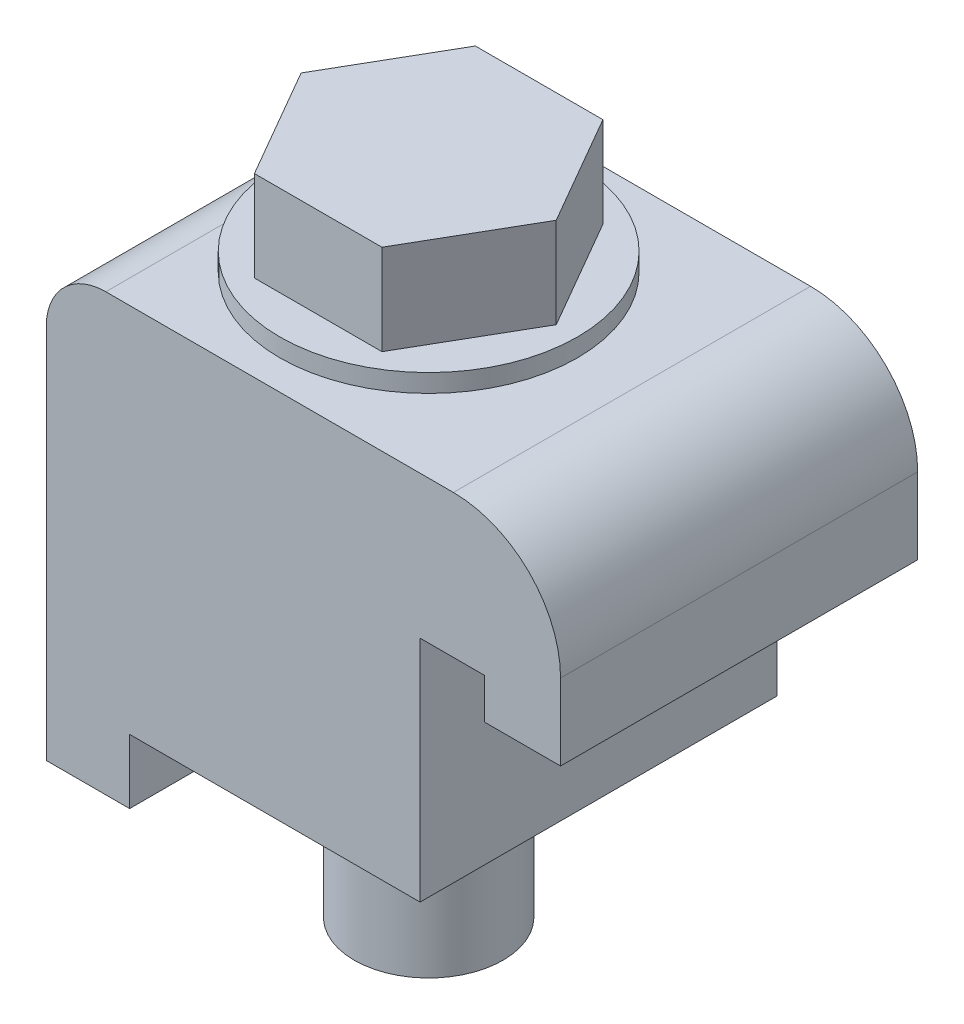
ISO-10303-21;
HEADER;
FILE_DESCRIPTION(('STEP AP214'),'2;1');
FILE_NAME('part.step','',(''),(''),'','','');
FILE_SCHEMA(('AUTOMOTIVE_DESIGN { 1 0 10303 214 1 1 1 1 }'));
ENDSEC;
DATA;
#1=APPLICATION_CONTEXT('core data for automotive mechanical design processes');
#2=APPLICATION_PROTOCOL_DEFINITION('international standard','automotive_design',2000,#1);
#3=PRODUCT_CONTEXT('',#1,'mechanical');
#4=PRODUCT('Part','Part','',(#3));
#5=PRODUCT_RELATED_PRODUCT_CATEGORY('part','',(#4));
#6=PRODUCT_DEFINITION_FORMATION('','',#4);
#7=PRODUCT_DEFINITION_CONTEXT('part definition',#1,'design');
#8=PRODUCT_DEFINITION('design','',#6,#7);
#9=PRODUCT_DEFINITION_SHAPE('','',#8);
#10=(LENGTH_UNIT() NAMED_UNIT(*) SI_UNIT(.MILLI.,.METRE.));
#11=(NAMED_UNIT(*) PLANE_ANGLE_UNIT() SI_UNIT($,.RADIAN.));
#12=(NAMED_UNIT(*) SI_UNIT($,.STERADIAN.) SOLID_ANGLE_UNIT());
#13=UNCERTAINTY_MEASURE_WITH_UNIT(LENGTH_MEASURE(1.E-05),#10,'distance_accuracy_value','');
#14=(GEOMETRIC_REPRESENTATION_CONTEXT(3) GLOBAL_UNCERTAINTY_ASSIGNED_CONTEXT((#13)) GLOBAL_UNIT_ASSIGNED_CONTEXT((#10,
#11,#12)) REPRESENTATION_CONTEXT('',''));
#15=CARTESIAN_POINT('',(0.,0.,0.));
#16=DIRECTION('',(0.,0.,1.));
#17=DIRECTION('',(1.,0.,0.));
#18=AXIS2_PLACEMENT_3D('',#15,#16,#17);
#19=CARTESIAN_POINT('',(-147.263380667439,27.57019994,0.));
#20=DIRECTION('',(-0.866025403784438,0.,0.500000000000001));
#21=DIRECTION('',(0.500000000000001,0.,0.866025403784438));
#22=AXIS2_PLACEMENT_3D('',#19,#20,#21);
#23=PLANE('',#22);
#24=DIRECTION('',(-0.500000000000001,0.,-0.866025403784438));
#25=VECTOR('',#24,1.);
#26=CARTESIAN_POINT('',(-147.263380667439,22.74419994,0.));
#27=LINE('',#26,#25);
#28=CARTESIAN_POINT('',(-147.263380667439,22.74419994,0.));
#29=VERTEX_POINT('',#28);
#30=CARTESIAN_POINT('',(-150.665590333719,22.74419994,-5.8928));
#31=VERTEX_POINT('',#30);
#32=EDGE_CURVE('E169',#29,#31,#27,.T.);
#33=ORIENTED_EDGE('',*,*,#32,.T.);
#34=DIRECTION('',(0.,-1.,0.));
#35=VECTOR('',#34,1.);
#36=CARTESIAN_POINT('',(-150.665590333719,27.57019994,-5.8928));
#37=LINE('',#36,#35);
#38=CARTESIAN_POINT('',(-150.665590333719,27.57019994,-5.8928));
#39=VERTEX_POINT('',#38);
#40=EDGE_CURVE('E51',#39,#31,#37,.T.);
#41=ORIENTED_EDGE('',*,*,#40,.F.);
#42=DIRECTION('',(-0.500000000000001,0.,-0.866025403784438));
#43=VECTOR('',#42,1.);
#44=CARTESIAN_POINT('',(-147.263380667439,27.57019994,0.));
#45=LINE('',#44,#43);
#46=CARTESIAN_POINT('',(-147.263380667439,27.57019994,0.));
#47=VERTEX_POINT('',#46);
#48=EDGE_CURVE('E180',#47,#39,#45,.T.);
#49=ORIENTED_EDGE('',*,*,#48,.F.);
#50=DIRECTION('',(0.,-1.,0.));
#51=VECTOR('',#50,1.);
#52=CARTESIAN_POINT('',(-147.263380667439,27.57019994,0.));
#53=LINE('',#52,#51);
#54=EDGE_CURVE('E165',#47,#29,#53,.T.);
#55=ORIENTED_EDGE('',*,*,#54,.T.);
#56=EDGE_LOOP('',(#33,#41,#49,#55));
#57=FACE_BOUND('',#56,.T.);
#58=ADVANCED_FACE('F85',(#57),#23,.F.);
#59=CARTESIAN_POINT('',(-150.665590333719,27.57019994,-5.8928));
#60=DIRECTION('',(0.,0.,1.));
#61=DIRECTION('',(1.,0.,0.));
#62=AXIS2_PLACEMENT_3D('',#59,#60,#61);
#63=PLANE('',#62);
#64=DIRECTION('',(-1.,0.,0.));
#65=VECTOR('',#64,1.);
#66=CARTESIAN_POINT('',(-150.665590333719,22.74419994,-5.8928));
#67=LINE('',#66,#65);
#68=CARTESIAN_POINT('',(-157.470009666281,22.74419994,-5.8928));
#69=VERTEX_POINT('',#68);
#70=EDGE_CURVE('E172',#31,#69,#67,.T.);
#71=ORIENTED_EDGE('',*,*,#70,.T.);
#72=DIRECTION('',(0.,-1.,0.));
#73=VECTOR('',#72,1.);
#74=CARTESIAN_POINT('',(-157.470009666281,27.57019994,-5.8928));
#75=LINE('',#74,#73);
#76=CARTESIAN_POINT('',(-157.470009666281,27.57019994,-5.8928));
#77=VERTEX_POINT('',#76);
#78=EDGE_CURVE('E93',#77,#69,#75,.T.);
#79=ORIENTED_EDGE('',*,*,#78,.F.);
#80=DIRECTION('',(-1.,0.,0.));
#81=VECTOR('',#80,1.);
#82=CARTESIAN_POINT('',(-150.665590333719,27.57019994,-5.8928));
#83=LINE('',#82,#81);
#84=EDGE_CURVE('E138',#39,#77,#83,.T.);
#85=ORIENTED_EDGE('',*,*,#84,.F.);
#86=ORIENTED_EDGE('',*,*,#40,.T.);
#87=EDGE_LOOP('',(#71,#79,#85,#86));
#88=FACE_BOUND('',#87,.T.);
#89=ADVANCED_FACE('F204',(#88),#63,.F.);
#90=CARTESIAN_POINT('',(-157.470009666281,27.57019994,-5.8928));
#91=DIRECTION('',(0.866025403784439,0.,0.5));
#92=DIRECTION('',(0.5,0.,-0.866025403784439));
#93=AXIS2_PLACEMENT_3D('',#90,#91,#92);
#94=PLANE('',#93);
#95=DIRECTION('',(-0.5,0.,0.866025403784439));
#96=VECTOR('',#95,1.);
#97=CARTESIAN_POINT('',(-157.470009666281,22.74419994,-5.8928));
#98=LINE('',#97,#96);
#99=CARTESIAN_POINT('',(-160.872219332561,22.74419994,0.));
#100=VERTEX_POINT('',#99);
#101=EDGE_CURVE('E175',#69,#100,#98,.T.);
#102=ORIENTED_EDGE('',*,*,#101,.T.);
#103=DIRECTION('',(0.,-1.,0.));
#104=VECTOR('',#103,1.);
#105=CARTESIAN_POINT('',(-160.872219332561,27.57019994,0.));
#106=LINE('',#105,#104);
#107=CARTESIAN_POINT('',(-160.872219332561,27.57019994,0.));
#108=VERTEX_POINT('',#107);
#109=EDGE_CURVE('E160',#108,#100,#106,.T.);
#110=ORIENTED_EDGE('',*,*,#109,.F.);
#111=DIRECTION('',(-0.5,0.,0.866025403784439));
#112=VECTOR('',#111,1.);
#113=CARTESIAN_POINT('',(-157.470009666281,27.57019994,-5.8928));
#114=LINE('',#113,#112);
#115=EDGE_CURVE('E151',#77,#108,#114,.T.);
#116=ORIENTED_EDGE('',*,*,#115,.F.);
#117=ORIENTED_EDGE('',*,*,#78,.T.);
#118=EDGE_LOOP('',(#102,#110,#116,#117));
#119=FACE_BOUND('',#118,.T.);
#120=ADVANCED_FACE('F186',(#119),#94,.F.);
#121=CARTESIAN_POINT('',(-160.872219332561,27.57019994,0.));
#122=DIRECTION('',(0.866025403784438,0.,-0.500000000000001));
#123=DIRECTION('',(-0.500000000000001,0.,-0.866025403784438));
#124=AXIS2_PLACEMENT_3D('',#121,#122,#123);
#125=PLANE('',#124);
#126=DIRECTION('',(0.500000000000001,0.,0.866025403784438));
#127=VECTOR('',#126,1.);
#128=CARTESIAN_POINT('',(-160.872219332561,22.74419994,0.));
#129=LINE('',#128,#127);
#130=CARTESIAN_POINT('',(-157.470009666281,22.74419994,5.8928));
#131=VERTEX_POINT('',#130);
#132=EDGE_CURVE('E159',#100,#131,#129,.T.);
#133=ORIENTED_EDGE('',*,*,#132,.T.);
#134=DIRECTION('',(0.,-1.,0.));
#135=VECTOR('',#134,1.);
#136=CARTESIAN_POINT('',(-157.470009666281,27.57019994,5.8928));
#137=LINE('',#136,#135);
#138=CARTESIAN_POINT('',(-157.470009666281,27.57019994,5.8928));
#139=VERTEX_POINT('',#138);
#140=EDGE_CURVE('E156',#139,#131,#137,.T.);
#141=ORIENTED_EDGE('',*,*,#140,.F.);
#142=DIRECTION('',(0.500000000000001,0.,0.866025403784438));
#143=VECTOR('',#142,1.);
#144=CARTESIAN_POINT('',(-160.872219332561,27.57019994,0.));
#145=LINE('',#144,#143);
#146=EDGE_CURVE('E145',#108,#139,#145,.T.);
#147=ORIENTED_EDGE('',*,*,#146,.F.);
#148=ORIENTED_EDGE('',*,*,#109,.T.);
#149=EDGE_LOOP('',(#133,#141,#147,#148));
#150=FACE_BOUND('',#149,.T.);
#151=ADVANCED_FACE('F157',(#150),#125,.F.);
#152=CARTESIAN_POINT('',(-157.470009666281,27.57019994,5.8928));
#153=DIRECTION('',(0.,0.,-1.));
#154=DIRECTION('',(-1.,0.,0.));
#155=AXIS2_PLACEMENT_3D('',#152,#153,#154);
#156=PLANE('',#155);
#157=DIRECTION('',(1.,0.,0.));
#158=VECTOR('',#157,1.);
#159=CARTESIAN_POINT('',(-157.470009666281,22.74419994,5.8928));
#160=LINE('',#159,#158);
#161=CARTESIAN_POINT('',(-150.665590333719,22.74419994,5.8928));
#162=VERTEX_POINT('',#161);
#163=EDGE_CURVE('E124',#131,#162,#160,.T.);
#164=ORIENTED_EDGE('',*,*,#163,.T.);
#165=DIRECTION('',(0.,-1.,0.));
#166=VECTOR('',#165,1.);
#167=CARTESIAN_POINT('',(-150.665590333719,27.57019994,5.8928));
#168=LINE('',#167,#166);
#169=CARTESIAN_POINT('',(-150.665590333719,27.57019994,5.8928));
#170=VERTEX_POINT('',#169);
#171=EDGE_CURVE('E161',#170,#162,#168,.T.);
#172=ORIENTED_EDGE('',*,*,#171,.F.);
#173=DIRECTION('',(1.,0.,0.));
#174=VECTOR('',#173,1.);
#175=CARTESIAN_POINT('',(-157.470009666281,27.57019994,5.8928));
#176=LINE('',#175,#174);
#177=EDGE_CURVE('E149',#139,#170,#176,.T.);
#178=ORIENTED_EDGE('',*,*,#177,.F.);
#179=ORIENTED_EDGE('',*,*,#140,.T.);
#180=EDGE_LOOP('',(#164,#172,#178,#179));
#181=FACE_BOUND('',#180,.T.);
#182=ADVANCED_FACE('F163',(#181),#156,.F.);
#183=CARTESIAN_POINT('',(-150.665590333719,27.57019994,5.8928));
#184=DIRECTION('',(-0.866025403784439,0.,-0.5));
#185=DIRECTION('',(-0.5,0.,0.866025403784439));
#186=AXIS2_PLACEMENT_3D('',#183,#184,#185);
#187=PLANE('',#186);
#188=DIRECTION('',(0.5,0.,-0.866025403784438));
#189=VECTOR('',#188,1.);
#190=CARTESIAN_POINT('',(-150.665590333719,22.74419994,5.8928));
#191=LINE('',#190,#189);
#192=EDGE_CURVE('E130',#162,#29,#191,.T.);
#193=ORIENTED_EDGE('',*,*,#192,.T.);
#194=ORIENTED_EDGE('',*,*,#54,.F.);
#195=DIRECTION('',(0.5,0.,-0.866025403784438));
#196=VECTOR('',#195,1.);
#197=CARTESIAN_POINT('',(-150.665590333719,27.57019994,5.8928));
#198=LINE('',#197,#196);
#199=EDGE_CURVE('E101',#170,#47,#198,.T.);
#200=ORIENTED_EDGE('',*,*,#199,.F.);
#201=ORIENTED_EDGE('',*,*,#171,.T.);
#202=EDGE_LOOP('',(#193,#194,#200,#201));
#203=FACE_BOUND('',#202,.T.);
#204=ADVANCED_FACE('F193',(#203),#187,.F.);
#205=CARTESIAN_POINT('',(0.,27.57019994,0.));
#206=DIRECTION('',(0.,1.,0.));
#207=DIRECTION('',(0.,0.,1.));
#208=AXIS2_PLACEMENT_3D('',#205,#206,#207);
#209=PLANE('',#208);
#210=ORIENTED_EDGE('',*,*,#48,.T.);
#211=ORIENTED_EDGE('',*,*,#84,.T.);
#212=ORIENTED_EDGE('',*,*,#115,.T.);
#213=ORIENTED_EDGE('',*,*,#146,.T.);
#214=ORIENTED_EDGE('',*,*,#177,.T.);
#215=ORIENTED_EDGE('',*,*,#199,.T.);
#216=EDGE_LOOP('',(#210,#211,#212,#213,#214,#215));
#217=FACE_BOUND('',#216,.T.);
#218=ADVANCED_FACE('F147',(#217),#209,.T.);
#219=CARTESIAN_POINT('',(0.,22.74419994,0.));
#220=DIRECTION('',(0.,1.,0.));
#221=DIRECTION('',(0.,0.,1.));
#222=AXIS2_PLACEMENT_3D('',#219,#220,#221);
#223=PLANE('',#222);
#224=CARTESIAN_POINT('',(-154.0678,22.74419994,0.));
#225=DIRECTION('',(0.,1.,0.));
#226=DIRECTION('',(0.,0.,1.));
#227=AXIS2_PLACEMENT_3D('',#224,#225,#226);
#228=CIRCLE('',#227,3.96874999999999);
#229=CARTESIAN_POINT('',(-154.0678,22.74419994,3.96874999999999));
#230=VERTEX_POINT('',#229);
#231=EDGE_CURVE('E280',#230,#230,#228,.T.);
#232=ORIENTED_EDGE('',*,*,#231,.T.);
#233=EDGE_LOOP('',(#232));
#234=FACE_BOUND('',#233,.T.);
#235=ORIENTED_EDGE('',*,*,#32,.F.);
#236=ORIENTED_EDGE('',*,*,#192,.F.);
#237=ORIENTED_EDGE('',*,*,#163,.F.);
#238=ORIENTED_EDGE('',*,*,#132,.F.);
#239=ORIENTED_EDGE('',*,*,#101,.F.);
#240=ORIENTED_EDGE('',*,*,#70,.F.);
#241=EDGE_LOOP('',(#235,#236,#237,#238,#239,#240));
#242=FACE_BOUND('',#241,.T.);
#243=ADVANCED_FACE('F189',(#234,#242),#223,.F.);
#244=CARTESIAN_POINT('',(-154.0678,-8.03280005999999,0.));
#245=DIRECTION('',(0.,1.,0.));
#246=DIRECTION('',(0.,0.,1.));
#247=AXIS2_PLACEMENT_3D('',#244,#245,#246);
#248=CYLINDRICAL_SURFACE('',#247,3.96874999999999);
#249=CARTESIAN_POINT('',(-154.0678,-8.03280005999999,0.));
#250=DIRECTION('',(0.,1.,0.));
#251=DIRECTION('',(0.,0.,1.));
#252=AXIS2_PLACEMENT_3D('',#249,#250,#251);
#253=CIRCLE('',#252,3.96874999999999);
#254=CARTESIAN_POINT('',(-154.0678,-8.03280005999999,3.96874999999999));
#255=VERTEX_POINT('',#254);
#256=EDGE_CURVE('E173',#255,#255,#253,.T.);
#257=ORIENTED_EDGE('',*,*,#256,.T.);
#258=EDGE_LOOP('',(#257));
#259=FACE_BOUND('',#258,.T.);
#260=ORIENTED_EDGE('',*,*,#231,.F.);
#261=EDGE_LOOP('',(#260));
#262=FACE_BOUND('',#261,.T.);
#263=ADVANCED_FACE('F250',(#259,#262),#248,.T.);
#264=CARTESIAN_POINT('',(-154.0678,-8.03280005999999,0.));
#265=DIRECTION('',(0.,1.,0.));
#266=DIRECTION('',(0.,0.,1.));
#267=AXIS2_PLACEMENT_3D('',#264,#265,#266);
#268=PLANE('',#267);
#269=ORIENTED_EDGE('',*,*,#256,.F.);
#270=EDGE_LOOP('',(#269));
#271=FACE_BOUND('',#270,.T.);
#272=ADVANCED_FACE('F259',(#271),#268,.F.);
#273=CLOSED_SHELL('',(#58,#89,#120,#151,#182,#204,#218,#243,#263,#272));
#274=MANIFOLD_SOLID_BREP('B6',#273);
#275=CARTESIAN_POINT('',(-154.0678,22.74419994,0.));
#276=DIRECTION('',(0.,1.,0.));
#277=DIRECTION('',(0.,0.,1.));
#278=AXIS2_PLACEMENT_3D('',#275,#276,#277);
#279=PLANE('',#278);
#280=CARTESIAN_POINT('',(-154.0678,22.74419994,0.));
#281=DIRECTION('',(0.,1.,0.));
#282=DIRECTION('',(0.,0.,1.));
#283=AXIS2_PLACEMENT_3D('',#280,#281,#282);
#284=CIRCLE('',#283,7.93749999999998);
#285=CARTESIAN_POINT('',(-154.0678,22.74419994,-7.93749999999998));
#286=VERTEX_POINT('',#285);
#287=EDGE_CURVE('E84',#286,#286,#284,.T.);
#288=ORIENTED_EDGE('',*,*,#287,.T.);
#289=EDGE_LOOP('',(#288));
#290=FACE_BOUND('',#289,.T.);
#291=CARTESIAN_POINT('',(-154.0678,22.74419994,0.));
#292=DIRECTION('',(0.,1.,0.));
#293=DIRECTION('',(0.,0.,1.));
#294=AXIS2_PLACEMENT_3D('',#291,#292,#293);
#295=CIRCLE('',#294,4.22910000000001);
#296=CARTESIAN_POINT('',(-154.0678,22.74419994,-4.22910000000001));
#297=VERTEX_POINT('',#296);
#298=EDGE_CURVE('E315',#297,#297,#295,.T.);
#299=ORIENTED_EDGE('',*,*,#298,.F.);
#300=EDGE_LOOP('',(#299));
#301=FACE_BOUND('',#300,.T.);
#302=ADVANCED_FACE('F304',(#290,#301),#279,.T.);
#303=CARTESIAN_POINT('',(-154.0678,21.77899994,0.));
#304=DIRECTION('',(0.,1.,0.));
#305=DIRECTION('',(0.,0.,1.));
#306=AXIS2_PLACEMENT_3D('',#303,#304,#305);
#307=PLANE('',#306);
#308=CARTESIAN_POINT('',(-154.0678,21.77899994,0.));
#309=DIRECTION('',(0.,1.,0.));
#310=DIRECTION('',(0.,0.,1.));
#311=AXIS2_PLACEMENT_3D('',#308,#309,#310);
#312=CIRCLE('',#311,7.93749999999998);
#313=CARTESIAN_POINT('',(-154.0678,21.77899994,-7.93749999999998));
#314=VERTEX_POINT('',#313);
#315=EDGE_CURVE('E308',#314,#314,#312,.T.);
#316=ORIENTED_EDGE('',*,*,#315,.F.);
#317=EDGE_LOOP('',(#316));
#318=FACE_BOUND('',#317,.T.);
#319=CARTESIAN_POINT('',(-154.0678,21.77899994,0.));
#320=DIRECTION('',(0.,1.,0.));
#321=DIRECTION('',(0.,0.,1.));
#322=AXIS2_PLACEMENT_3D('',#319,#320,#321);
#323=CIRCLE('',#322,4.22910000000001);
#324=CARTESIAN_POINT('',(-154.0678,21.77899994,-4.22910000000001));
#325=VERTEX_POINT('',#324);
#326=EDGE_CURVE('E317',#325,#325,#323,.T.);
#327=ORIENTED_EDGE('',*,*,#326,.T.);
#328=EDGE_LOOP('',(#327));
#329=FACE_BOUND('',#328,.T.);
#330=ADVANCED_FACE('F327',(#318,#329),#307,.F.);
#331=CARTESIAN_POINT('',(-154.0678,22.74419994,0.));
#332=DIRECTION('',(0.,-1.,0.));
#333=DIRECTION('',(0.,0.,-1.));
#334=AXIS2_PLACEMENT_3D('',#331,#332,#333);
#335=CYLINDRICAL_SURFACE('',#334,7.93749999999998);
#336=CARTESIAN_POINT('',(-154.0678,22.74419994,-7.93749999999998));
#337=CARTESIAN_POINT('',(-154.0678,22.7341457733333,-7.93749999999998));
#338=CARTESIAN_POINT('',(-154.0678,22.7240916066667,-7.93749999999998));
#339=CARTESIAN_POINT('',(-154.0678,22.7039832733333,-7.93749999999998));
#340=CARTESIAN_POINT('',(-154.0678,22.6939291066667,-7.93749999999998));
#341=CARTESIAN_POINT('',(-154.0678,22.6738207733333,-7.93749999999998));
#342=CARTESIAN_POINT('',(-154.0678,22.6637666066667,-7.93749999999998));
#343=CARTESIAN_POINT('',(-154.0678,22.6436582733333,-7.93749999999998));
#344=CARTESIAN_POINT('',(-154.0678,22.6336041066667,-7.93749999999998));
#345=CARTESIAN_POINT('',(-154.0678,22.6134957733333,-7.93749999999998));
#346=CARTESIAN_POINT('',(-154.0678,22.6034416066667,-7.93749999999998));
#347=CARTESIAN_POINT('',(-154.0678,22.5833332733333,-7.93749999999998));
#348=CARTESIAN_POINT('',(-154.0678,22.5732791066667,-7.93749999999998));
#349=CARTESIAN_POINT('',(-154.0678,22.5531707733333,-7.93749999999998));
#350=CARTESIAN_POINT('',(-154.0678,22.5431166066667,-7.93749999999998));
#351=CARTESIAN_POINT('',(-154.0678,22.5230082733333,-7.93749999999998));
#352=CARTESIAN_POINT('',(-154.0678,22.5129541066667,-7.93749999999998));
#353=CARTESIAN_POINT('',(-154.0678,22.4928457733333,-7.93749999999998));
#354=CARTESIAN_POINT('',(-154.0678,22.4827916066667,-7.93749999999998));
#355=CARTESIAN_POINT('',(-154.0678,22.4626832733333,-7.93749999999998));
#356=CARTESIAN_POINT('',(-154.0678,22.4526291066667,-7.93749999999998));
#357=CARTESIAN_POINT('',(-154.0678,22.4325207733333,-7.93749999999998));
#358=CARTESIAN_POINT('',(-154.0678,22.4224666066667,-7.93749999999998));
#359=CARTESIAN_POINT('',(-154.0678,22.4023582733333,-7.93749999999998));
#360=CARTESIAN_POINT('',(-154.0678,22.3923041066667,-7.93749999999998));
#361=CARTESIAN_POINT('',(-154.0678,22.3721957733333,-7.93749999999998));
#362=CARTESIAN_POINT('',(-154.0678,22.3621416066667,-7.93749999999998));
#363=CARTESIAN_POINT('',(-154.0678,22.3420332733333,-7.93749999999998));
#364=CARTESIAN_POINT('',(-154.0678,22.3319791066667,-7.93749999999998));
#365=CARTESIAN_POINT('',(-154.0678,22.3118707733333,-7.93749999999998));
#366=CARTESIAN_POINT('',(-154.0678,22.3018166066667,-7.93749999999998));
#367=CARTESIAN_POINT('',(-154.0678,22.2817082733333,-7.93749999999998));
#368=CARTESIAN_POINT('',(-154.0678,22.2716541066667,-7.93749999999998));
#369=CARTESIAN_POINT('',(-154.0678,22.2515457733333,-7.93749999999998));
#370=CARTESIAN_POINT('',(-154.0678,22.2414916066667,-7.93749999999998));
#371=CARTESIAN_POINT('',(-154.0678,22.2213832733333,-7.93749999999998));
#372=CARTESIAN_POINT('',(-154.0678,22.2113291066667,-7.93749999999998));
#373=CARTESIAN_POINT('',(-154.0678,22.1912207733333,-7.93749999999998));
#374=CARTESIAN_POINT('',(-154.0678,22.1811666066667,-7.93749999999998));
#375=CARTESIAN_POINT('',(-154.0678,22.1610582733333,-7.93749999999998));
#376=CARTESIAN_POINT('',(-154.0678,22.1510041066667,-7.93749999999998));
#377=CARTESIAN_POINT('',(-154.0678,22.1308957733333,-7.93749999999998));
#378=CARTESIAN_POINT('',(-154.0678,22.1208416066667,-7.93749999999998));
#379=CARTESIAN_POINT('',(-154.0678,22.1007332733333,-7.93749999999998));
#380=CARTESIAN_POINT('',(-154.0678,22.0906791066667,-7.93749999999998));
#381=CARTESIAN_POINT('',(-154.0678,22.0705707733333,-7.93749999999998));
#382=CARTESIAN_POINT('',(-154.0678,22.0605166066667,-7.93749999999998));
#383=CARTESIAN_POINT('',(-154.0678,22.0404082733333,-7.93749999999998));
#384=CARTESIAN_POINT('',(-154.0678,22.0303541066667,-7.93749999999998));
#385=CARTESIAN_POINT('',(-154.0678,22.0102457733333,-7.93749999999998));
#386=CARTESIAN_POINT('',(-154.0678,22.0001916066667,-7.93749999999998));
#387=CARTESIAN_POINT('',(-154.0678,21.9800832733333,-7.93749999999998));
#388=CARTESIAN_POINT('',(-154.0678,21.9700291066667,-7.93749999999998));
#389=CARTESIAN_POINT('',(-154.0678,21.9499207733333,-7.93749999999998));
#390=CARTESIAN_POINT('',(-154.0678,21.9398666066667,-7.93749999999998));
#391=CARTESIAN_POINT('',(-154.0678,21.9197582733333,-7.93749999999998));
#392=CARTESIAN_POINT('',(-154.0678,21.9097041066667,-7.93749999999998));
#393=CARTESIAN_POINT('',(-154.0678,21.8895957733333,-7.93749999999998));
#394=CARTESIAN_POINT('',(-154.0678,21.8795416066667,-7.93749999999998));
#395=CARTESIAN_POINT('',(-154.0678,21.8594332733333,-7.93749999999998));
#396=CARTESIAN_POINT('',(-154.0678,21.8493791066667,-7.93749999999998));
#397=CARTESIAN_POINT('',(-154.0678,21.8292707733333,-7.93749999999998));
#398=CARTESIAN_POINT('',(-154.0678,21.8192166066667,-7.93749999999998));
#399=CARTESIAN_POINT('',(-154.0678,21.7991082733333,-7.93749999999998));
#400=CARTESIAN_POINT('',(-154.0678,21.7890541066667,-7.93749999999998));
#401=CARTESIAN_POINT('',(-154.0678,21.77899994,-7.93749999999998));
#402=B_SPLINE_CURVE_WITH_KNOTS('',3,(#336,#337,#338,#339,#340,#341,#342,#343,#344,#345,#346,
#347,#348,#349,#350,#351,#352,#353,#354,#355,#356,#357,#358,#359,#360,#361,#362,#363,#364,#365,
#366,#367,#368,#369,#370,#371,#372,#373,#374,#375,#376,#377,#378,#379,#380,#381,#382,#383,#384,
#385,#386,#387,#388,#389,#390,#391,#392,#393,#394,#395,#396,#397,#398,#399,#400,#401),
.UNSPECIFIED.,.F.,.F.,(4,2,2,2,2,2,2,2,2,2,2,2,2,2,2,2,2,2,2,2,2,2,2,2,2,2,2,2,2,2,2,2,4),(0.,
0.0301625000000035,0.0603250000000034,0.0904875000000034,0.120650000000003,0.1508125,
0.180975000000003,0.211137500000003,0.241300000000003,0.2714625,0.301625,0.3317875,
0.361950000000003,0.392112500000003,0.422275000000003,0.452437500000003,0.482600000000003,
0.5127625,0.542925,0.5730875,0.60325,0.6334125,0.663575,0.6937375,0.723900000000003,
0.754062500000003,0.784225000000003,0.814387500000003,0.844550000000003,0.874712500000003,
0.904875000000003,0.935037500000003,0.965200000000003),.UNSPECIFIED.);
#403=EDGE_CURVE('BSEAM306',#286,#314,#402,.T.);
#404=ORIENTED_EDGE('',*,*,#287,.F.);
#405=ORIENTED_EDGE('',*,*,#315,.T.);
#406=ORIENTED_EDGE('',*,*,#403,.T.);
#407=ORIENTED_EDGE('',*,*,#403,.F.);
#408=EDGE_LOOP('',(#404,#406,#405,#407));
#409=FACE_BOUND('',#408,.T.);
#410=ADVANCED_FACE('F306',(#409),#335,.T.);
#411=CARTESIAN_POINT('',(-154.0678,22.74419994,0.));
#412=DIRECTION('',(0.,-1.,0.));
#413=DIRECTION('',(0.,0.,-1.));
#414=AXIS2_PLACEMENT_3D('',#411,#412,#413);
#415=CYLINDRICAL_SURFACE('',#414,4.22910000000001);
#416=CARTESIAN_POINT('',(-154.0678,22.74419994,-4.22910000000001));
#417=CARTESIAN_POINT('',(-154.0678,22.7341457733333,-4.22910000000001));
#418=CARTESIAN_POINT('',(-154.0678,22.7240916066667,-4.22910000000001));
#419=CARTESIAN_POINT('',(-154.0678,22.7039832733333,-4.22910000000001));
#420=CARTESIAN_POINT('',(-154.0678,22.6939291066667,-4.22910000000001));
#421=CARTESIAN_POINT('',(-154.0678,22.6738207733333,-4.22910000000001));
#422=CARTESIAN_POINT('',(-154.0678,22.6637666066667,-4.22910000000001));
#423=CARTESIAN_POINT('',(-154.0678,22.6436582733333,-4.22910000000001));
#424=CARTESIAN_POINT('',(-154.0678,22.6336041066667,-4.22910000000001));
#425=CARTESIAN_POINT('',(-154.0678,22.6134957733333,-4.22910000000001));
#426=CARTESIAN_POINT('',(-154.0678,22.6034416066667,-4.22910000000001));
#427=CARTESIAN_POINT('',(-154.0678,22.5833332733333,-4.22910000000001));
#428=CARTESIAN_POINT('',(-154.0678,22.5732791066667,-4.22910000000001));
#429=CARTESIAN_POINT('',(-154.0678,22.5531707733333,-4.22910000000001));
#430=CARTESIAN_POINT('',(-154.0678,22.5431166066667,-4.22910000000001));
#431=CARTESIAN_POINT('',(-154.0678,22.5230082733333,-4.22910000000001));
#432=CARTESIAN_POINT('',(-154.0678,22.5129541066667,-4.22910000000001));
#433=CARTESIAN_POINT('',(-154.0678,22.4928457733333,-4.22910000000001));
#434=CARTESIAN_POINT('',(-154.0678,22.4827916066667,-4.22910000000001));
#435=CARTESIAN_POINT('',(-154.0678,22.4626832733333,-4.22910000000001));
#436=CARTESIAN_POINT('',(-154.0678,22.4526291066667,-4.22910000000001));
#437=CARTESIAN_POINT('',(-154.0678,22.4325207733333,-4.22910000000001));
#438=CARTESIAN_POINT('',(-154.0678,22.4224666066667,-4.22910000000001));
#439=CARTESIAN_POINT('',(-154.0678,22.4023582733333,-4.22910000000001));
#440=CARTESIAN_POINT('',(-154.0678,22.3923041066667,-4.22910000000001));
#441=CARTESIAN_POINT('',(-154.0678,22.3721957733333,-4.22910000000001));
#442=CARTESIAN_POINT('',(-154.0678,22.3621416066667,-4.22910000000001));
#443=CARTESIAN_POINT('',(-154.0678,22.3420332733333,-4.22910000000001));
#444=CARTESIAN_POINT('',(-154.0678,22.3319791066667,-4.22910000000001));
#445=CARTESIAN_POINT('',(-154.0678,22.3118707733333,-4.22910000000001));
#446=CARTESIAN_POINT('',(-154.0678,22.3018166066667,-4.22910000000001));
#447=CARTESIAN_POINT('',(-154.0678,22.2817082733333,-4.22910000000001));
#448=CARTESIAN_POINT('',(-154.0678,22.2716541066667,-4.22910000000001));
#449=CARTESIAN_POINT('',(-154.0678,22.2515457733333,-4.22910000000001));
#450=CARTESIAN_POINT('',(-154.0678,22.2414916066667,-4.22910000000001));
#451=CARTESIAN_POINT('',(-154.0678,22.2213832733333,-4.22910000000001));
#452=CARTESIAN_POINT('',(-154.0678,22.2113291066667,-4.22910000000001));
#453=CARTESIAN_POINT('',(-154.0678,22.1912207733333,-4.22910000000001));
#454=CARTESIAN_POINT('',(-154.0678,22.1811666066667,-4.22910000000001));
#455=CARTESIAN_POINT('',(-154.0678,22.1610582733333,-4.22910000000001));
#456=CARTESIAN_POINT('',(-154.0678,22.1510041066667,-4.22910000000001));
#457=CARTESIAN_POINT('',(-154.0678,22.1308957733333,-4.22910000000001));
#458=CARTESIAN_POINT('',(-154.0678,22.1208416066667,-4.22910000000001));
#459=CARTESIAN_POINT('',(-154.0678,22.1007332733333,-4.22910000000001));
#460=CARTESIAN_POINT('',(-154.0678,22.0906791066667,-4.22910000000001));
#461=CARTESIAN_POINT('',(-154.0678,22.0705707733333,-4.22910000000001));
#462=CARTESIAN_POINT('',(-154.0678,22.0605166066667,-4.22910000000001));
#463=CARTESIAN_POINT('',(-154.0678,22.0404082733333,-4.22910000000001));
#464=CARTESIAN_POINT('',(-154.0678,22.0303541066667,-4.22910000000001));
#465=CARTESIAN_POINT('',(-154.0678,22.0102457733333,-4.22910000000001));
#466=CARTESIAN_POINT('',(-154.0678,22.0001916066667,-4.22910000000001));
#467=CARTESIAN_POINT('',(-154.0678,21.9800832733333,-4.22910000000001));
#468=CARTESIAN_POINT('',(-154.0678,21.9700291066667,-4.22910000000001));
#469=CARTESIAN_POINT('',(-154.0678,21.9499207733333,-4.22910000000001));
#470=CARTESIAN_POINT('',(-154.0678,21.9398666066667,-4.22910000000001));
#471=CARTESIAN_POINT('',(-154.0678,21.9197582733333,-4.22910000000001));
#472=CARTESIAN_POINT('',(-154.0678,21.9097041066667,-4.22910000000001));
#473=CARTESIAN_POINT('',(-154.0678,21.8895957733333,-4.22910000000001));
#474=CARTESIAN_POINT('',(-154.0678,21.8795416066667,-4.22910000000001));
#475=CARTESIAN_POINT('',(-154.0678,21.8594332733333,-4.22910000000001));
#476=CARTESIAN_POINT('',(-154.0678,21.8493791066667,-4.22910000000001));
#477=CARTESIAN_POINT('',(-154.0678,21.8292707733333,-4.22910000000001));
#478=CARTESIAN_POINT('',(-154.0678,21.8192166066667,-4.22910000000001));
#479=CARTESIAN_POINT('',(-154.0678,21.7991082733333,-4.22910000000001));
#480=CARTESIAN_POINT('',(-154.0678,21.7890541066667,-4.22910000000001));
#481=CARTESIAN_POINT('',(-154.0678,21.77899994,-4.22910000000001));
#482=B_SPLINE_CURVE_WITH_KNOTS('',3,(#416,#417,#418,#419,#420,#421,#422,#423,#424,#425,#426,
#427,#428,#429,#430,#431,#432,#433,#434,#435,#436,#437,#438,#439,#440,#441,#442,#443,#444,#445,
#446,#447,#448,#449,#450,#451,#452,#453,#454,#455,#456,#457,#458,#459,#460,#461,#462,#463,#464,
#465,#466,#467,#468,#469,#470,#471,#472,#473,#474,#475,#476,#477,#478,#479,#480,#481),
.UNSPECIFIED.,.F.,.F.,(4,2,2,2,2,2,2,2,2,2,2,2,2,2,2,2,2,2,2,2,2,2,2,2,2,2,2,2,2,2,2,2,4),(0.,
0.0301625000000035,0.0603250000000034,0.0904875000000034,0.120650000000003,0.1508125,
0.180975000000003,0.211137500000003,0.241300000000003,0.2714625,0.301625,0.3317875,
0.361950000000003,0.392112500000003,0.422275000000003,0.452437500000003,0.482600000000003,
0.5127625,0.542925,0.5730875,0.60325,0.6334125,0.663575,0.6937375,0.723900000000003,
0.754062500000003,0.784225000000003,0.814387500000003,0.844550000000003,0.874712500000003,
0.904875000000003,0.935037500000003,0.965200000000003),.UNSPECIFIED.);
#483=EDGE_CURVE('BSEAM323',#297,#325,#482,.T.);
#484=ORIENTED_EDGE('',*,*,#298,.T.);
#485=ORIENTED_EDGE('',*,*,#326,.F.);
#486=ORIENTED_EDGE('',*,*,#483,.T.);
#487=ORIENTED_EDGE('',*,*,#483,.F.);
#488=EDGE_LOOP('',(#484,#486,#485,#487));
#489=FACE_BOUND('',#488,.T.);
#490=ADVANCED_FACE('F323',(#489),#415,.F.);
#491=CLOSED_SHELL('',(#302,#330,#410,#490));
#492=MANIFOLD_SOLID_BREP('B45',#491);
#493=CARTESIAN_POINT('',(-164.939,18.60399994,-9.525));
#494=DIRECTION('',(-1.,0.,0.));
#495=DIRECTION('',(0.,0.,1.));
#496=AXIS2_PLACEMENT_3D('',#493,#494,#495);
#497=PLANE('',#496);
#498=DIRECTION('',(0.,-1.,0.));
#499=VECTOR('',#498,1.);
#500=CARTESIAN_POINT('',(-164.939,18.60399994,-9.525));
#501=LINE('',#500,#499);
#502=CARTESIAN_POINT('',(-164.939,18.60399994,-9.525));
#503=VERTEX_POINT('',#502);
#504=CARTESIAN_POINT('',(-164.939,-1.46200006000002,-9.525));
#505=VERTEX_POINT('',#504);
#506=EDGE_CURVE('E467',#503,#505,#501,.T.);
#507=ORIENTED_EDGE('',*,*,#506,.T.);
#508=DIRECTION('',(0.,0.,1.));
#509=VECTOR('',#508,1.);
#510=CARTESIAN_POINT('',(-164.939,-1.46200006000002,-15.1389171707463));
#511=LINE('',#510,#509);
#512=CARTESIAN_POINT('',(-164.939,-1.46200006000002,9.525));
#513=VERTEX_POINT('',#512);
#514=EDGE_CURVE('E466',#505,#513,#511,.T.);
#515=ORIENTED_EDGE('',*,*,#514,.T.);
#516=DIRECTION('',(0.,-1.,0.));
#517=VECTOR('',#516,1.);
#518=CARTESIAN_POINT('',(-164.939,18.60399994,9.525));
#519=LINE('',#518,#517);
#520=CARTESIAN_POINT('',(-164.939,18.60399994,9.525));
#521=VERTEX_POINT('',#520);
#522=EDGE_CURVE('E453',#521,#513,#519,.T.);
#523=ORIENTED_EDGE('',*,*,#522,.F.);
#524=DIRECTION('',(0.,0.,1.));
#525=VECTOR('',#524,1.);
#526=CARTESIAN_POINT('',(-164.939,18.60399994,-9.525));
#527=LINE('',#526,#525);
#528=EDGE_CURVE('E302',#503,#521,#527,.T.);
#529=ORIENTED_EDGE('',*,*,#528,.F.);
#530=EDGE_LOOP('',(#507,#515,#523,#529));
#531=FACE_BOUND('',#530,.T.);
#532=ADVANCED_FACE('F365',(#531),#497,.T.);
#533=CARTESIAN_POINT('',(-161.764,18.60399994,-9.525));
#534=DIRECTION('',(0.,0.,1.));
#535=DIRECTION('',(1.,0.,0.));
#536=AXIS2_PLACEMENT_3D('',#533,#534,#535);
#537=CYLINDRICAL_SURFACE('',#536,3.17500000000002);
#538=ORIENTED_EDGE('',*,*,#528,.T.);
#539=CARTESIAN_POINT('',(-161.764,18.60399994,9.525));
#540=DIRECTION('',(0.,0.,1.));
#541=DIRECTION('',(1.,0.,0.));
#542=AXIS2_PLACEMENT_3D('',#539,#540,#541);
#543=CIRCLE('',#542,3.17500000000002);
#544=CARTESIAN_POINT('',(-161.764,21.77899994,9.525));
#545=VERTEX_POINT('',#544);
#546=EDGE_CURVE('E461',#545,#521,#543,.T.);
#547=ORIENTED_EDGE('',*,*,#546,.F.);
#548=DIRECTION('',(0.,0.,1.));
#549=VECTOR('',#548,1.);
#550=CARTESIAN_POINT('',(-161.764,21.77899994,-9.525));
#551=LINE('',#550,#549);
#552=CARTESIAN_POINT('',(-161.764,21.77899994,-9.525));
#553=VERTEX_POINT('',#552);
#554=EDGE_CURVE('E373',#553,#545,#551,.T.);
#555=ORIENTED_EDGE('',*,*,#554,.F.);
#556=CARTESIAN_POINT('',(-161.764,18.60399994,-9.525));
#557=DIRECTION('',(0.,0.,1.));
#558=DIRECTION('',(1.,0.,0.));
#559=AXIS2_PLACEMENT_3D('',#556,#557,#558);
#560=CIRCLE('',#559,3.17500000000002);
#561=EDGE_CURVE('E508',#553,#503,#560,.T.);
#562=ORIENTED_EDGE('',*,*,#561,.T.);
#563=EDGE_LOOP('',(#538,#547,#555,#562));
#564=FACE_BOUND('',#563,.T.);
#565=ADVANCED_FACE('F594',(#564),#537,.T.);
#566=CARTESIAN_POINT('',(-143.222,21.77899994,-9.525));
#567=DIRECTION('',(0.,1.,0.));
#568=DIRECTION('',(-1.,0.,0.));
#569=AXIS2_PLACEMENT_3D('',#566,#567,#568);
#570=PLANE('',#569);
#571=CARTESIAN_POINT('',(-154.0678,21.77899994,0.));
#572=DIRECTION('',(0.,-1.,0.));
#573=DIRECTION('',(0.,0.,-1.));
#574=AXIS2_PLACEMENT_3D('',#571,#572,#573);
#575=CIRCLE('',#574,4.52120000000001);
#576=CARTESIAN_POINT('',(-154.0678,21.77899994,-4.52120000000001));
#577=VERTEX_POINT('',#576);
#578=EDGE_CURVE('E477',#577,#577,#575,.T.);
#579=ORIENTED_EDGE('',*,*,#578,.T.);
#580=EDGE_LOOP('',(#579));
#581=FACE_BOUND('',#580,.T.);
#582=ORIENTED_EDGE('',*,*,#554,.T.);
#583=DIRECTION('',(-1.,0.,0.));
#584=VECTOR('',#583,1.);
#585=CARTESIAN_POINT('',(-143.222,21.77899994,9.525));
#586=LINE('',#585,#584);
#587=CARTESIAN_POINT('',(-143.222,21.77899994,9.525));
#588=VERTEX_POINT('',#587);
#589=EDGE_CURVE('E547',#588,#545,#586,.T.);
#590=ORIENTED_EDGE('',*,*,#589,.F.);
#591=DIRECTION('',(0.,0.,1.));
#592=VECTOR('',#591,1.);
#593=CARTESIAN_POINT('',(-143.222,21.77899994,-9.525));
#594=LINE('',#593,#592);
#595=CARTESIAN_POINT('',(-143.222,21.77899994,-9.525));
#596=VERTEX_POINT('',#595);
#597=EDGE_CURVE('E518',#596,#588,#594,.T.);
#598=ORIENTED_EDGE('',*,*,#597,.F.);
#599=DIRECTION('',(-1.,0.,0.));
#600=VECTOR('',#599,1.);
#601=CARTESIAN_POINT('',(-143.222,21.77899994,-9.525));
#602=LINE('',#601,#600);
#603=EDGE_CURVE('E523',#596,#553,#602,.T.);
#604=ORIENTED_EDGE('',*,*,#603,.T.);
#605=EDGE_LOOP('',(#582,#590,#598,#604));
#606=FACE_BOUND('',#605,.T.);
#607=ADVANCED_FACE('F591',(#581,#606),#570,.T.);
#608=CARTESIAN_POINT('',(-143.222,16.06399994,-9.525));
#609=DIRECTION('',(0.,0.,1.));
#610=DIRECTION('',(1.,0.,0.));
#611=AXIS2_PLACEMENT_3D('',#608,#609,#610);
#612=CYLINDRICAL_SURFACE('',#611,5.715);
#613=ORIENTED_EDGE('',*,*,#597,.T.);
#614=CARTESIAN_POINT('',(-143.222,16.06399994,9.525));
#615=DIRECTION('',(0.,0.,1.));
#616=DIRECTION('',(1.,0.,0.));
#617=AXIS2_PLACEMENT_3D('',#614,#615,#616);
#618=CIRCLE('',#617,5.715);
#619=CARTESIAN_POINT('',(-137.507,16.06399994,9.525));
#620=VERTEX_POINT('',#619);
#621=EDGE_CURVE('E549',#620,#588,#618,.T.);
#622=ORIENTED_EDGE('',*,*,#621,.F.);
#623=DIRECTION('',(0.,0.,1.));
#624=VECTOR('',#623,1.);
#625=CARTESIAN_POINT('',(-137.507,16.06399994,-9.525));
#626=LINE('',#625,#624);
#627=CARTESIAN_POINT('',(-137.507,16.06399994,-9.525));
#628=VERTEX_POINT('',#627);
#629=EDGE_CURVE('E516',#628,#620,#626,.T.);
#630=ORIENTED_EDGE('',*,*,#629,.F.);
#631=CARTESIAN_POINT('',(-143.222,16.06399994,-9.525));
#632=DIRECTION('',(0.,0.,1.));
#633=DIRECTION('',(1.,0.,0.));
#634=AXIS2_PLACEMENT_3D('',#631,#632,#633);
#635=CIRCLE('',#634,5.715);
#636=EDGE_CURVE('E526',#628,#596,#635,.T.);
#637=ORIENTED_EDGE('',*,*,#636,.T.);
#638=EDGE_LOOP('',(#613,#622,#630,#637));
#639=FACE_BOUND('',#638,.T.);
#640=ADVANCED_FACE('F587',(#639),#612,.T.);
#641=CARTESIAN_POINT('',(-137.507,11.99999994,-9.525));
#642=DIRECTION('',(1.,0.,0.));
#643=DIRECTION('',(0.,0.,-1.));
#644=AXIS2_PLACEMENT_3D('',#641,#642,#643);
#645=PLANE('',#644);
#646=ORIENTED_EDGE('',*,*,#629,.T.);
#647=DIRECTION('',(0.,1.,0.));
#648=VECTOR('',#647,1.);
#649=CARTESIAN_POINT('',(-137.507,11.99999994,9.525));
#650=LINE('',#649,#648);
#651=CARTESIAN_POINT('',(-137.507,11.99999994,9.525));
#652=VERTEX_POINT('',#651);
#653=EDGE_CURVE('E552',#652,#620,#650,.T.);
#654=ORIENTED_EDGE('',*,*,#653,.F.);
#655=DIRECTION('',(0.,0.,1.));
#656=VECTOR('',#655,1.);
#657=CARTESIAN_POINT('',(-137.507,11.99999994,-9.525));
#658=LINE('',#657,#656);
#659=CARTESIAN_POINT('',(-137.507,11.99999994,-9.525));
#660=VERTEX_POINT('',#659);
#661=EDGE_CURVE('E514',#660,#652,#658,.T.);
#662=ORIENTED_EDGE('',*,*,#661,.F.);
#663=DIRECTION('',(0.,1.,0.));
#664=VECTOR('',#663,1.);
#665=CARTESIAN_POINT('',(-137.507,11.99999994,-9.525));
#666=LINE('',#665,#664);
#667=EDGE_CURVE('E529',#660,#628,#666,.T.);
#668=ORIENTED_EDGE('',*,*,#667,.T.);
#669=EDGE_LOOP('',(#646,#654,#662,#668));
#670=FACE_BOUND('',#669,.T.);
#671=ADVANCED_FACE('F585',(#670),#645,.T.);
#672=CARTESIAN_POINT('',(-141.571,11.99999994,-9.525));
#673=DIRECTION('',(0.,-1.,0.));
#674=DIRECTION('',(0.,0.,-1.));
#675=AXIS2_PLACEMENT_3D('',#672,#673,#674);
#676=PLANE('',#675);
#677=ORIENTED_EDGE('',*,*,#661,.T.);
#678=DIRECTION('',(1.,0.,0.));
#679=VECTOR('',#678,1.);
#680=CARTESIAN_POINT('',(-141.571,11.99999994,9.525));
#681=LINE('',#680,#679);
#682=CARTESIAN_POINT('',(-141.571,11.99999994,9.525));
#683=VERTEX_POINT('',#682);
#684=EDGE_CURVE('E555',#683,#652,#681,.T.);
#685=ORIENTED_EDGE('',*,*,#684,.F.);
#686=DIRECTION('',(0.,0.,1.));
#687=VECTOR('',#686,1.);
#688=CARTESIAN_POINT('',(-141.571,11.99999994,-9.525));
#689=LINE('',#688,#687);
#690=CARTESIAN_POINT('',(-141.571,11.99999994,-9.525));
#691=VERTEX_POINT('',#690);
#692=EDGE_CURVE('E512',#691,#683,#689,.T.);
#693=ORIENTED_EDGE('',*,*,#692,.F.);
#694=DIRECTION('',(1.,0.,0.));
#695=VECTOR('',#694,1.);
#696=CARTESIAN_POINT('',(-141.571,11.99999994,-9.525));
#697=LINE('',#696,#695);
#698=EDGE_CURVE('E532',#691,#660,#697,.T.);
#699=ORIENTED_EDGE('',*,*,#698,.T.);
#700=EDGE_LOOP('',(#677,#685,#693,#699));
#701=FACE_BOUND('',#700,.T.);
#702=ADVANCED_FACE('F580',(#701),#676,.T.);
#703=CARTESIAN_POINT('',(-141.571,14.15899994,-9.525));
#704=DIRECTION('',(-1.,0.,0.));
#705=DIRECTION('',(0.,0.,1.));
#706=AXIS2_PLACEMENT_3D('',#703,#704,#705);
#707=PLANE('',#706);
#708=ORIENTED_EDGE('',*,*,#692,.T.);
#709=DIRECTION('',(0.,-1.,0.));
#710=VECTOR('',#709,1.);
#711=CARTESIAN_POINT('',(-141.571,14.15899994,9.525));
#712=LINE('',#711,#710);
#713=CARTESIAN_POINT('',(-141.571,14.15899994,9.525));
#714=VERTEX_POINT('',#713);
#715=EDGE_CURVE('E558',#714,#683,#712,.T.);
#716=ORIENTED_EDGE('',*,*,#715,.F.);
#717=DIRECTION('',(0.,0.,1.));
#718=VECTOR('',#717,1.);
#719=CARTESIAN_POINT('',(-141.571,14.15899994,-9.525));
#720=LINE('',#719,#718);
#721=CARTESIAN_POINT('',(-141.571,14.15899994,-9.525));
#722=VERTEX_POINT('',#721);
#723=EDGE_CURVE('E510',#722,#714,#720,.T.);
#724=ORIENTED_EDGE('',*,*,#723,.F.);
#725=DIRECTION('',(0.,-1.,0.));
#726=VECTOR('',#725,1.);
#727=CARTESIAN_POINT('',(-141.571,14.15899994,-9.525));
#728=LINE('',#727,#726);
#729=EDGE_CURVE('E535',#722,#691,#728,.T.);
#730=ORIENTED_EDGE('',*,*,#729,.T.);
#731=EDGE_LOOP('',(#708,#716,#724,#730));
#732=FACE_BOUND('',#731,.T.);
#733=ADVANCED_FACE('F573',(#732),#707,.T.);
#734=CARTESIAN_POINT('',(-145.,14.15899994,-9.525));
#735=DIRECTION('',(0.,-1.,0.));
#736=DIRECTION('',(0.,0.,-1.));
#737=AXIS2_PLACEMENT_3D('',#734,#735,#736);
#738=PLANE('',#737);
#739=ORIENTED_EDGE('',*,*,#723,.T.);
#740=DIRECTION('',(1.,0.,0.));
#741=VECTOR('',#740,1.);
#742=CARTESIAN_POINT('',(-145.,14.15899994,9.525));
#743=LINE('',#742,#741);
#744=CARTESIAN_POINT('',(-145.,14.15899994,9.525));
#745=VERTEX_POINT('',#744);
#746=EDGE_CURVE('E560',#745,#714,#743,.T.);
#747=ORIENTED_EDGE('',*,*,#746,.F.);
#748=DIRECTION('',(0.,0.,1.));
#749=VECTOR('',#748,1.);
#750=CARTESIAN_POINT('',(-145.,14.15899994,-9.525));
#751=LINE('',#750,#749);
#752=CARTESIAN_POINT('',(-145.,14.15899994,-9.525));
#753=VERTEX_POINT('',#752);
#754=EDGE_CURVE('E507',#753,#745,#751,.T.);
#755=ORIENTED_EDGE('',*,*,#754,.F.);
#756=DIRECTION('',(1.,0.,0.));
#757=VECTOR('',#756,1.);
#758=CARTESIAN_POINT('',(-145.,14.15899994,-9.525));
#759=LINE('',#758,#757);
#760=EDGE_CURVE('E538',#753,#722,#759,.T.);
#761=ORIENTED_EDGE('',*,*,#760,.T.);
#762=EDGE_LOOP('',(#739,#747,#755,#761));
#763=FACE_BOUND('',#762,.T.);
#764=ADVANCED_FACE('F569',(#763),#738,.T.);
#765=CARTESIAN_POINT('',(-145.,1.96699993999998,-9.525));
#766=DIRECTION('',(1.,0.,0.));
#767=DIRECTION('',(0.,0.,-1.));
#768=AXIS2_PLACEMENT_3D('',#765,#766,#767);
#769=PLANE('',#768);
#770=ORIENTED_EDGE('',*,*,#754,.T.);
#771=DIRECTION('',(0.,1.,0.));
#772=VECTOR('',#771,1.);
#773=CARTESIAN_POINT('',(-145.,1.96699993999998,9.525));
#774=LINE('',#773,#772);
#775=CARTESIAN_POINT('',(-145.,1.96699993999998,9.525));
#776=VERTEX_POINT('',#775);
#777=EDGE_CURVE('E501',#776,#745,#774,.T.);
#778=ORIENTED_EDGE('',*,*,#777,.F.);
#779=DIRECTION('',(0.,0.,1.));
#780=VECTOR('',#779,1.);
#781=CARTESIAN_POINT('',(-145.,1.96699993999998,-9.525));
#782=LINE('',#781,#780);
#783=CARTESIAN_POINT('',(-145.,1.96699993999998,-9.525));
#784=VERTEX_POINT('',#783);
#785=EDGE_CURVE('E504',#784,#776,#782,.T.);
#786=ORIENTED_EDGE('',*,*,#785,.F.);
#787=DIRECTION('',(0.,1.,0.));
#788=VECTOR('',#787,1.);
#789=CARTESIAN_POINT('',(-145.,1.96699993999998,-9.525));
#790=LINE('',#789,#788);
#791=EDGE_CURVE('E541',#784,#753,#790,.T.);
#792=ORIENTED_EDGE('',*,*,#791,.T.);
#793=EDGE_LOOP('',(#770,#778,#786,#792));
#794=FACE_BOUND('',#793,.T.);
#795=ADVANCED_FACE('F616',(#794),#769,.T.);
#796=CARTESIAN_POINT('',(-164.939,1.96699993999998,-9.525));
#797=DIRECTION('',(0.,-1.,0.));
#798=DIRECTION('',(0.,0.,-1.));
#799=AXIS2_PLACEMENT_3D('',#796,#797,#798);
#800=PLANE('',#799);
#801=CARTESIAN_POINT('',(-154.0678,1.96699993999998,0.));
#802=DIRECTION('',(0.,-1.,0.));
#803=DIRECTION('',(0.,0.,-1.));
#804=AXIS2_PLACEMENT_3D('',#801,#802,#803);
#805=CIRCLE('',#804,4.52120000000001);
#806=CARTESIAN_POINT('',(-154.0678,1.96699993999998,-4.52120000000001));
#807=VERTEX_POINT('',#806);
#808=EDGE_CURVE('E481',#807,#807,#805,.T.);
#809=ORIENTED_EDGE('',*,*,#808,.F.);
#810=EDGE_LOOP('',(#809));
#811=FACE_BOUND('',#810,.T.);
#812=DIRECTION('',(0.,0.,1.));
#813=VECTOR('',#812,1.);
#814=CARTESIAN_POINT('',(-160.494,1.96699993999998,-15.1389171707463));
#815=LINE('',#814,#813);
#816=CARTESIAN_POINT('',(-160.494,1.96699993999998,-9.525));
#817=VERTEX_POINT('',#816);
#818=CARTESIAN_POINT('',(-160.494,1.96699993999998,9.525));
#819=VERTEX_POINT('',#818);
#820=EDGE_CURVE('E381',#817,#819,#815,.T.);
#821=ORIENTED_EDGE('',*,*,#820,.F.);
#822=DIRECTION('',(1.,0.,0.));
#823=VECTOR('',#822,1.);
#824=CARTESIAN_POINT('',(-164.939,1.96699993999998,-9.525));
#825=LINE('',#824,#823);
#826=EDGE_CURVE('E490',#817,#784,#825,.T.);
#827=ORIENTED_EDGE('',*,*,#826,.T.);
#828=ORIENTED_EDGE('',*,*,#785,.T.);
#829=DIRECTION('',(1.,0.,0.));
#830=VECTOR('',#829,1.);
#831=CARTESIAN_POINT('',(-164.939,1.96699993999998,9.525));
#832=LINE('',#831,#830);
#833=EDGE_CURVE('E462',#819,#776,#832,.T.);
#834=ORIENTED_EDGE('',*,*,#833,.F.);
#835=EDGE_LOOP('',(#821,#827,#828,#834));
#836=FACE_BOUND('',#835,.T.);
#837=ADVANCED_FACE('F618',(#811,#836),#800,.T.);
#838=CARTESIAN_POINT('',(-143.222,16.06399994,-9.525));
#839=DIRECTION('',(0.,0.,1.));
#840=DIRECTION('',(1.,0.,0.));
#841=AXIS2_PLACEMENT_3D('',#838,#839,#840);
#842=PLANE('',#841);
#843=ORIENTED_EDGE('',*,*,#506,.F.);
#844=ORIENTED_EDGE('',*,*,#561,.F.);
#845=ORIENTED_EDGE('',*,*,#603,.F.);
#846=ORIENTED_EDGE('',*,*,#636,.F.);
#847=ORIENTED_EDGE('',*,*,#667,.F.);
#848=ORIENTED_EDGE('',*,*,#698,.F.);
#849=ORIENTED_EDGE('',*,*,#729,.F.);
#850=ORIENTED_EDGE('',*,*,#760,.F.);
#851=ORIENTED_EDGE('',*,*,#791,.F.);
#852=ORIENTED_EDGE('',*,*,#826,.F.);
#853=DIRECTION('',(0.,-1.,0.));
#854=VECTOR('',#853,1.);
#855=CARTESIAN_POINT('',(-160.494,1.96699993999998,-9.525));
#856=LINE('',#855,#854);
#857=CARTESIAN_POINT('',(-160.494,-1.46200006000002,-9.525));
#858=VERTEX_POINT('',#857);
#859=EDGE_CURVE('E489',#817,#858,#856,.T.);
#860=ORIENTED_EDGE('',*,*,#859,.T.);
#861=DIRECTION('',(-1.,0.,0.));
#862=VECTOR('',#861,1.);
#863=CARTESIAN_POINT('',(-164.939,-1.46200006000002,-9.525));
#864=LINE('',#863,#862);
#865=EDGE_CURVE('E463',#858,#505,#864,.T.);
#866=ORIENTED_EDGE('',*,*,#865,.T.);
#867=EDGE_LOOP('',(#843,#844,#845,#846,#847,#848,#849,#850,#851,#852,#860,#866));
#868=FACE_BOUND('',#867,.T.);
#869=ADVANCED_FACE('F575',(#868),#842,.F.);
#870=CARTESIAN_POINT('',(-143.222,16.06399994,9.525));
#871=DIRECTION('',(0.,0.,1.));
#872=DIRECTION('',(1.,0.,0.));
#873=AXIS2_PLACEMENT_3D('',#870,#871,#872);
#874=PLANE('',#873);
#875=ORIENTED_EDGE('',*,*,#522,.T.);
#876=DIRECTION('',(1.,0.,0.));
#877=VECTOR('',#876,1.);
#878=CARTESIAN_POINT('',(-164.939,-1.46200006000002,9.525));
#879=LINE('',#878,#877);
#880=CARTESIAN_POINT('',(-160.494,-1.46200006000002,9.525));
#881=VERTEX_POINT('',#880);
#882=EDGE_CURVE('E458',#513,#881,#879,.T.);
#883=ORIENTED_EDGE('',*,*,#882,.T.);
#884=DIRECTION('',(0.,1.,0.));
#885=VECTOR('',#884,1.);
#886=CARTESIAN_POINT('',(-160.494,1.96699993999998,9.525));
#887=LINE('',#886,#885);
#888=EDGE_CURVE('E472',#881,#819,#887,.T.);
#889=ORIENTED_EDGE('',*,*,#888,.T.);
#890=ORIENTED_EDGE('',*,*,#833,.T.);
#891=ORIENTED_EDGE('',*,*,#777,.T.);
#892=ORIENTED_EDGE('',*,*,#746,.T.);
#893=ORIENTED_EDGE('',*,*,#715,.T.);
#894=ORIENTED_EDGE('',*,*,#684,.T.);
#895=ORIENTED_EDGE('',*,*,#653,.T.);
#896=ORIENTED_EDGE('',*,*,#621,.T.);
#897=ORIENTED_EDGE('',*,*,#589,.T.);
#898=ORIENTED_EDGE('',*,*,#546,.T.);
#899=EDGE_LOOP('',(#875,#883,#889,#890,#891,#892,#893,#894,#895,#896,#897,#898));
#900=FACE_BOUND('',#899,.T.);
#901=ADVANCED_FACE('F455',(#900),#874,.T.);
#902=CARTESIAN_POINT('',(-160.494,1.96699993999998,-15.1389171707463));
#903=DIRECTION('',(1.,0.,0.));
#904=DIRECTION('',(0.,0.,-1.));
#905=AXIS2_PLACEMENT_3D('',#902,#903,#904);
#906=PLANE('',#905);
#907=ORIENTED_EDGE('',*,*,#859,.F.);
#908=ORIENTED_EDGE('',*,*,#820,.T.);
#909=ORIENTED_EDGE('',*,*,#888,.F.);
#910=DIRECTION('',(0.,0.,1.));
#911=VECTOR('',#910,1.);
#912=CARTESIAN_POINT('',(-160.494,-1.46200006000002,-15.1389171707463));
#913=LINE('',#912,#911);
#914=EDGE_CURVE('E471',#858,#881,#913,.T.);
#915=ORIENTED_EDGE('',*,*,#914,.F.);
#916=EDGE_LOOP('',(#907,#908,#909,#915));
#917=FACE_BOUND('',#916,.T.);
#918=ADVANCED_FACE('F634',(#917),#906,.T.);
#919=CARTESIAN_POINT('',(-164.939,-1.46200006000002,-15.1389171707463));
#920=DIRECTION('',(0.,-1.,0.));
#921=DIRECTION('',(0.,0.,-1.));
#922=AXIS2_PLACEMENT_3D('',#919,#920,#921);
#923=PLANE('',#922);
#924=ORIENTED_EDGE('',*,*,#865,.F.);
#925=ORIENTED_EDGE('',*,*,#914,.T.);
#926=ORIENTED_EDGE('',*,*,#882,.F.);
#927=ORIENTED_EDGE('',*,*,#514,.F.);
#928=EDGE_LOOP('',(#924,#925,#926,#927));
#929=FACE_BOUND('',#928,.T.);
#930=ADVANCED_FACE('F474',(#929),#923,.T.);
#931=CARTESIAN_POINT('',(-154.0678,21.77899994,0.));
#932=DIRECTION('',(0.,-1.,0.));
#933=DIRECTION('',(0.,0.,-1.));
#934=AXIS2_PLACEMENT_3D('',#931,#932,#933);
#935=CYLINDRICAL_SURFACE('',#934,4.52120000000001);
#936=ORIENTED_EDGE('',*,*,#578,.F.);
#937=EDGE_LOOP('',(#936));
#938=FACE_BOUND('',#937,.T.);
#939=ORIENTED_EDGE('',*,*,#808,.T.);
#940=EDGE_LOOP('',(#939));
#941=FACE_BOUND('',#940,.T.);
#942=ADVANCED_FACE('F627',(#938,#941),#935,.F.);
#943=CLOSED_SHELL('',(#532,#565,#607,#640,#671,#702,#733,#764,#795,#837,#869,#901,#918,#930,#942));
#944=MANIFOLD_SOLID_BREP('B79',#943);
#945=ADVANCED_BREP_SHAPE_REPRESENTATION('',(#18,#274,#492,#944),#14);
#946=SHAPE_DEFINITION_REPRESENTATION(#9,#945);
ENDSEC;
END-ISO-10303-21;
